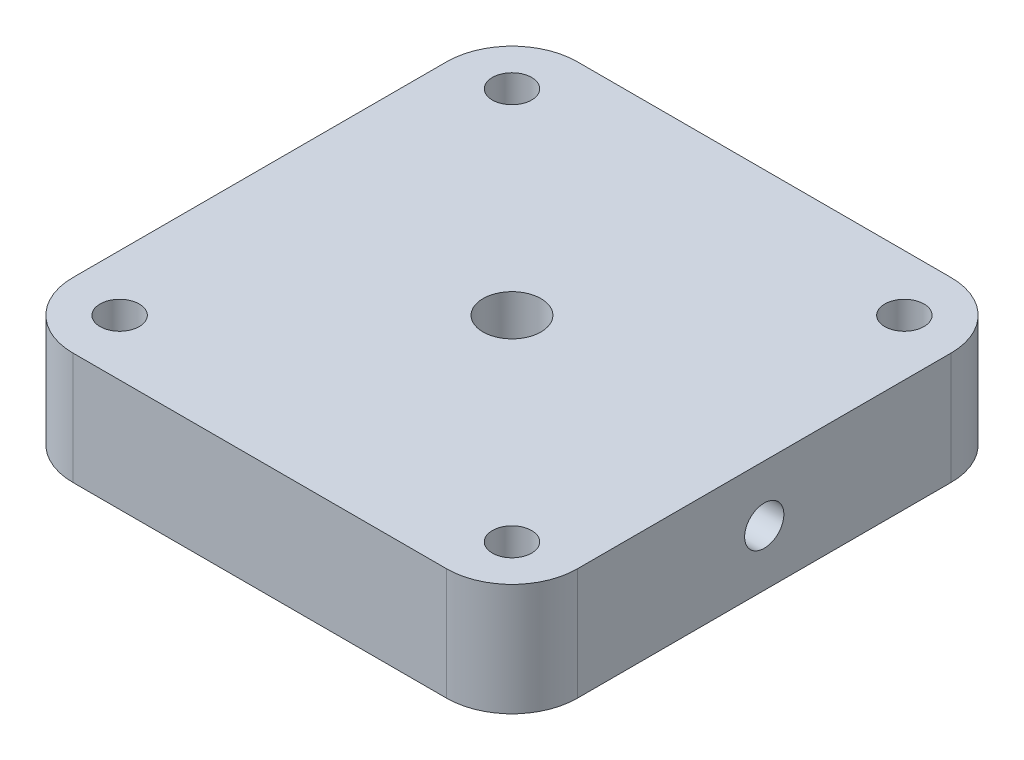
ISO-10303-21;
HEADER;
FILE_DESCRIPTION(('STEP AP214'),'2;1');
FILE_NAME('part.step','',(''),(''),'','','');
FILE_SCHEMA(('AUTOMOTIVE_DESIGN { 1 0 10303 214 1 1 1 1 }'));
ENDSEC;
DATA;
#1=APPLICATION_CONTEXT('core data for automotive mechanical design processes');
#2=APPLICATION_PROTOCOL_DEFINITION('international standard','automotive_design',2000,#1);
#3=PRODUCT_CONTEXT('',#1,'mechanical');
#4=PRODUCT('Part','Part','',(#3));
#5=PRODUCT_RELATED_PRODUCT_CATEGORY('part','',(#4));
#6=PRODUCT_DEFINITION_FORMATION('','',#4);
#7=PRODUCT_DEFINITION_CONTEXT('part definition',#1,'design');
#8=PRODUCT_DEFINITION('design','',#6,#7);
#9=PRODUCT_DEFINITION_SHAPE('','',#8);
#10=(LENGTH_UNIT() NAMED_UNIT(*) SI_UNIT(.MILLI.,.METRE.));
#11=(NAMED_UNIT(*) PLANE_ANGLE_UNIT() SI_UNIT($,.RADIAN.));
#12=(NAMED_UNIT(*) SI_UNIT($,.STERADIAN.) SOLID_ANGLE_UNIT());
#13=UNCERTAINTY_MEASURE_WITH_UNIT(LENGTH_MEASURE(1.E-05),#10,'distance_accuracy_value','');
#14=(GEOMETRIC_REPRESENTATION_CONTEXT(3) GLOBAL_UNCERTAINTY_ASSIGNED_CONTEXT((#13)) GLOBAL_UNIT_ASSIGNED_CONTEXT((#10,
#11,#12)) REPRESENTATION_CONTEXT('',''));
#15=CARTESIAN_POINT('',(0.,0.,0.));
#16=DIRECTION('',(0.,0.,1.));
#17=DIRECTION('',(1.,0.,0.));
#18=AXIS2_PLACEMENT_3D('',#15,#16,#17);
#19=CARTESIAN_POINT('',(0.,6.,0.));
#20=DIRECTION('',(0.,-1.,0.));
#21=DIRECTION('',(0.,0.,-1.));
#22=AXIS2_PLACEMENT_3D('',#19,#20,#21);
#23=CYLINDRICAL_SURFACE('',#22,1.55);
#24=CARTESIAN_POINT('',(0.,6.,0.));
#25=DIRECTION('',(0.,1.,0.));
#26=DIRECTION('',(0.,0.,1.));
#27=AXIS2_PLACEMENT_3D('',#24,#25,#26);
#28=CIRCLE('',#27,1.55);
#29=CARTESIAN_POINT('',(0.,6.,1.55));
#30=VERTEX_POINT('',#29);
#31=EDGE_CURVE('E150',#30,#30,#28,.T.);
#32=ORIENTED_EDGE('',*,*,#31,.T.);
#33=EDGE_LOOP('',(#32));
#34=FACE_BOUND('',#33,.T.);
#35=CARTESIAN_POINT('',(1.14017542509914,3.,-1.05));
#36=CARTESIAN_POINT('',(1.14017867015507,2.94900963420674,-1.04999821419493));
#37=CARTESIAN_POINT('',(1.14366002654204,2.89800924220033,-1.04625354384456));
#38=CARTESIAN_POINT('',(1.1568831260506,2.79785450026968,-1.03160621451335));
#39=CARTESIAN_POINT('',(1.16663643736445,2.74870373954835,-1.02069032790875));
#40=CARTESIAN_POINT('',(1.19063587654834,2.65402513586156,-0.99258247022336));
#41=CARTESIAN_POINT('',(1.20483629623293,2.60846608887573,-0.97545408099523));
#42=CARTESIAN_POINT('',(1.23604765734176,2.52095107432004,-0.935588965368678));
#43=CARTESIAN_POINT('',(1.2530590702133,2.47899571294126,-0.912851297891147));
#44=CARTESIAN_POINT('',(1.29126839399223,2.39244917131674,-0.858143379971789));
#45=CARTESIAN_POINT('',(1.31269852239262,2.34852831311729,-0.82527482070063));
#46=CARTESIAN_POINT('',(1.35542510236173,2.2662339234301,-0.753052250023912));
#47=CARTESIAN_POINT('',(1.37672137615719,2.22786669647558,-0.713690974768842));
#48=CARTESIAN_POINT('',(1.42057281100614,2.15198704860325,-0.622421145712551));
#49=CARTESIAN_POINT('',(1.44282976523745,2.11548505936816,-0.569515093428983));
#50=CARTESIAN_POINT('',(1.48244379819408,2.05224164661509,-0.456532980371657));
#51=CARTESIAN_POINT('',(1.49980994826338,2.02548212564266,-0.396470491729013));
#52=CARTESIAN_POINT('',(1.52395637739943,1.98877337115996,-0.286977102679294));
#53=CARTESIAN_POINT('',(1.53230674875396,1.97627768189748,-0.238739890848447));
#54=CARTESIAN_POINT('',(1.54441732768806,1.958236651145,-0.140428894987793));
#55=CARTESIAN_POINT('',(1.54818104655478,1.9526859928368,-0.0903565461264037));
#56=CARTESIAN_POINT('',(1.55078454545249,1.94884129107043,0.0102799053623988));
#57=CARTESIAN_POINT('',(1.54961608027011,1.9505593989394,0.0608446903432232));
#58=CARTESIAN_POINT('',(1.5424453765433,1.96117719516602,0.160866717743167));
#59=CARTESIAN_POINT('',(1.53644171779535,1.97007899353435,0.210323630368249));
#60=CARTESIAN_POINT('',(1.52027351978192,1.99436012750092,0.305905604269505));
#61=CARTESIAN_POINT('',(1.51018596000131,2.00961976821787,0.352074663851375));
#62=CARTESIAN_POINT('',(1.48661872554945,2.04594244074747,0.441122460304474));
#63=CARTESIAN_POINT('',(1.47313840723046,2.06700657381527,0.48400057082599));
#64=CARTESIAN_POINT('',(1.44200714008745,2.11693224909356,0.570490025978871));
#65=CARTESIAN_POINT('',(1.42405735210557,2.14640508912612,0.613639189387359));
#66=CARTESIAN_POINT('',(1.3863364122706,2.21094062254783,0.694675336425618));
#67=CARTESIAN_POINT('',(1.36656315993046,2.24600979729875,0.732556122132322));
#68=CARTESIAN_POINT('',(1.32320458148413,2.32749756325242,0.808610513798524));
#69=CARTESIAN_POINT('',(1.29953795721076,2.37483289879481,0.845759562267655));
#70=CARTESIAN_POINT('',(1.25409644644155,2.47579828748114,0.911781713046712));
#71=CARTESIAN_POINT('',(1.23232049517091,2.529424757092,0.940659494850997));
#72=CARTESIAN_POINT('',(1.19833674612205,2.62899504546996,0.983387524367705));
#73=CARTESIAN_POINT('',(1.1850845633505,2.67374436865162,0.999177497539191));
#74=CARTESIAN_POINT('',(1.16308870281454,2.76597202100341,1.0247005377039));
#75=CARTESIAN_POINT('',(1.15433680120382,2.81344519477477,1.03444465971397));
#76=CARTESIAN_POINT('',(1.14267160065129,2.91042516719409,1.04732201747659));
#77=CARTESIAN_POINT('',(1.13980605917333,2.959945300333,1.05040118959419));
#78=CARTESIAN_POINT('',(1.14062241382638,3.05887013095543,1.04951451812422));
#79=CARTESIAN_POINT('',(1.14430452385913,3.10827482461493,1.04554844437926));
#80=CARTESIAN_POINT('',(1.15676027366424,3.19982312256097,1.03173431058622));
#81=CARTESIAN_POINT('',(1.16492289209837,3.24216368215364,1.02258858266146));
#82=CARTESIAN_POINT('',(1.18481280391291,3.32463243729466,0.999475254976788));
#83=CARTESIAN_POINT('',(1.19654335846435,3.36475856899953,0.985503242296032));
#84=CARTESIAN_POINT('',(1.22827804506535,3.45988463054165,0.945901634432641));
#85=CARTESIAN_POINT('',(1.2496276112737,3.51343147689458,0.917856367454053));
#86=CARTESIAN_POINT('',(1.29439957988697,3.6144312656647,0.853562742804815));
#87=CARTESIAN_POINT('',(1.31782576050675,3.66187269890165,0.817299238222145));
#88=CARTESIAN_POINT('',(1.36458676622985,3.75069131865502,0.736619512937508));
#89=CARTESIAN_POINT('',(1.38791595923925,3.79197668487577,0.692098565958788));
#90=CARTESIAN_POINT('',(1.43188834177728,3.86672651376633,0.595808158198262));
#91=CARTESIAN_POINT('',(1.45253576557754,3.90020337355864,0.544050398791507));
#92=CARTESIAN_POINT('',(1.48584758053399,3.95293277528256,0.443880565912961));
#93=CARTESIAN_POINT('',(1.4992781455831,3.97365436686804,0.396498721397153));
#94=CARTESIAN_POINT('',(1.52186138768814,4.0080832741919,0.298278889511241));
#95=CARTESIAN_POINT('',(1.53101680898026,4.02179509007789,0.247443143293868));
#96=CARTESIAN_POINT('',(1.54424865884391,4.0415172234934,0.143379502371016));
#97=CARTESIAN_POINT('',(1.54830086878771,4.04749082108213,0.0901414337876248));
#98=CARTESIAN_POINT('',(1.55083034670219,4.05122647541262,-0.0167540354150383));
#99=CARTESIAN_POINT('',(1.54930871354019,4.04899015071701,-0.0704113512996604));
#100=CARTESIAN_POINT('',(1.54119463080679,4.03696557613547,-0.172088179712366));
#101=CARTESIAN_POINT('',(1.53501557154223,4.02779279592043,-0.220216418794356));
#102=CARTESIAN_POINT('',(1.51859400866711,4.00310145741962,-0.314076134260564));
#103=CARTESIAN_POINT('',(1.50835085830735,3.98758188910993,-0.359807227857124));
#104=CARTESIAN_POINT('',(1.48393914823175,3.94989069947766,-0.450258358624311));
#105=CARTESIAN_POINT('',(1.46959480663393,3.92741626691739,-0.494803455011253));
#106=CARTESIAN_POINT('',(1.43826428265189,3.87692418956758,-0.579605927185485));
#107=CARTESIAN_POINT('',(1.42127667766249,3.84890355758936,-0.619860974294072));
#108=CARTESIAN_POINT('',(1.3829237609655,3.78313699544349,-0.701692388600341));
#109=CARTESIAN_POINT('',(1.36129105992349,3.74455379270573,-0.74247018998955));
#110=CARTESIAN_POINT('',(1.31769231231216,3.66148742431758,-0.817352909695226));
#111=CARTESIAN_POINT('',(1.29572599449733,3.61699920204656,-0.851452046239778));
#112=CARTESIAN_POINT('',(1.25459217589983,3.52498471912444,-0.910898905905993));
#113=CARTESIAN_POINT('',(1.23533908553332,3.47772889961438,-0.936604111165215));
#114=CARTESIAN_POINT('',(1.20053484703963,3.37870665273446,-0.98082077047066));
#115=CARTESIAN_POINT('',(1.18497755506889,3.32694790950188,-0.999344196278547));
#116=CARTESIAN_POINT('',(1.16227015819414,3.22952719825286,-1.02560981703896));
#117=CARTESIAN_POINT('',(1.15410464817601,3.18447294420416,-1.03470153399788));
#118=CARTESIAN_POINT('',(1.14305924749589,3.09294728495041,-1.04689353441485));
#119=CARTESIAN_POINT('',(1.14017246722499,3.0464778075418,-1.05000162776444));
#120=CARTESIAN_POINT('',(1.14017542509914,3.,-1.05));
#121=B_SPLINE_CURVE_WITH_KNOTS('',3,(#35,#36,#37,#38,#39,#40,#41,#42,#43,#44,#45,#46,#47,#48,
#49,#50,#51,#52,#53,#54,#55,#56,#57,#58,#59,#60,#61,#62,#63,#64,#65,#66,#67,#68,#69,#70,#71,#72,
#73,#74,#75,#76,#77,#78,#79,#80,#81,#82,#83,#84,#85,#86,#87,#88,#89,#90,#91,#92,#93,#94,#95,#96,
#97,#98,#99,#100,#101,#102,#103,#104,#105,#106,#107,#108,#109,#110,#111,#112,#113,#114,#115,
#116,#117,#118,#119,#120),.UNSPECIFIED.,.T.,.F.,(4,2,2,2,2,2,2,2,2,2,2,2,2,2,2,2,2,2,2,2,2,2,2,
2,2,2,2,2,2,2,2,2,2,2,2,2,2,2,2,2,2,2,4),(0.,0.152757492701431,0.305797547440881,
0.457313578292913,0.608855046581285,0.78489427841393,0.961131810148025,1.16407376716305,
1.3666367954264,1.51755455491686,1.66835670740331,1.81941105808704,1.97050979296988,
2.11888397139867,2.26728631946701,2.43241709092866,2.5977405144187,2.79089941374287,
2.98394881599575,3.13121136561914,3.27820384158419,3.42638426684011,3.57456953301222,
3.70629384021264,3.83813890995304,4.02944283538514,4.2211022598794,4.41538314525939,
4.60935344988734,4.76897940160997,4.92850274729966,5.08878033450001,5.24902632513084,
5.3965133566357,5.54402386827438,5.69917184581499,5.85440361472219,6.03419476174309,
6.21414087398844,6.38491478711176,6.55540278974062,6.69482360862136,6.8340623302091),.UNSPECIFIED.);
#122=CARTESIAN_POINT('',(1.14017542509914,3.,1.05));
#123=VERTEX_POINT('',#122);
#124=CARTESIAN_POINT('',(1.14017542509914,3.,-1.05));
#125=VERTEX_POINT('',#124);
#126=EDGE_CURVE('E178',#123,#125,#121,.T.);
#127=ORIENTED_EDGE('',*,*,#126,.F.);
#128=CARTESIAN_POINT('',(0.,3.,0.));
#129=DIRECTION('',(0.,-1.,0.));
#130=DIRECTION('',(0.,0.,-1.));
#131=AXIS2_PLACEMENT_3D('',#128,#129,#130);
#132=CIRCLE('',#131,1.55);
#133=CARTESIAN_POINT('',(-1.14017542509914,3.,1.05));
#134=VERTEX_POINT('',#133);
#135=EDGE_CURVE('E222',#123,#134,#132,.T.);
#136=ORIENTED_EDGE('',*,*,#135,.T.);
#137=CARTESIAN_POINT('',(-1.14017542509914,3.,-1.05));
#138=CARTESIAN_POINT('',(-1.14017867015507,3.05099036579326,-1.04999821419493));
#139=CARTESIAN_POINT('',(-1.14366002654204,3.10199075779967,-1.04625354384456));
#140=CARTESIAN_POINT('',(-1.1568831260506,3.20214549973032,-1.03160621451335));
#141=CARTESIAN_POINT('',(-1.16663643736445,3.25129626045165,-1.02069032790875));
#142=CARTESIAN_POINT('',(-1.19063587654834,3.34597486413844,-0.992582470223359));
#143=CARTESIAN_POINT('',(-1.20483629623293,3.39153391112427,-0.975454080995229));
#144=CARTESIAN_POINT('',(-1.23604765734176,3.47904892567996,-0.935588965368677));
#145=CARTESIAN_POINT('',(-1.2530590702133,3.52100428705874,-0.912851297891146));
#146=CARTESIAN_POINT('',(-1.29126839399223,3.60755082868326,-0.858143379971789));
#147=CARTESIAN_POINT('',(-1.31269852239262,3.65147168688271,-0.825274820700629));
#148=CARTESIAN_POINT('',(-1.35542510236173,3.7337660765699,-0.753052250023912));
#149=CARTESIAN_POINT('',(-1.37672137615718,3.77213330352442,-0.713690974768842));
#150=CARTESIAN_POINT('',(-1.42057281100613,3.84801295139675,-0.622421145712551));
#151=CARTESIAN_POINT('',(-1.44282976523745,3.88451494063184,-0.569515093428983));
#152=CARTESIAN_POINT('',(-1.48244379819407,3.94775835338491,-0.456532980371657));
#153=CARTESIAN_POINT('',(-1.49980994826337,3.97451787435734,-0.396470491729013));
#154=CARTESIAN_POINT('',(-1.52395637739942,4.01122662884004,-0.286977102679294));
#155=CARTESIAN_POINT('',(-1.53230674875396,4.02372231810252,-0.238739890848447));
#156=CARTESIAN_POINT('',(-1.54441732768806,4.041763348855,-0.140428894987793));
#157=CARTESIAN_POINT('',(-1.54818104655478,4.0473140071632,-0.0903565461264036));
#158=CARTESIAN_POINT('',(-1.55078454545249,4.05115870892957,0.0102799053623991));
#159=CARTESIAN_POINT('',(-1.54961608027011,4.0494406010606,0.0608446903432236));
#160=CARTESIAN_POINT('',(-1.5424453765433,4.03882280483398,0.160866717743167));
#161=CARTESIAN_POINT('',(-1.53644171779534,4.02992100646565,0.21032363036825));
#162=CARTESIAN_POINT('',(-1.52027351978191,4.00563987249908,0.305905604269505));
#163=CARTESIAN_POINT('',(-1.51018596000131,3.99038023178214,0.352074663851375));
#164=CARTESIAN_POINT('',(-1.48661872554945,3.95405755925253,0.441122460304475));
#165=CARTESIAN_POINT('',(-1.47313840723045,3.93299342618473,0.48400057082599));
#166=CARTESIAN_POINT('',(-1.44200714008745,3.88306775090644,0.570490025978872));
#167=CARTESIAN_POINT('',(-1.42405735210556,3.85359491087388,0.61363918938736));
#168=CARTESIAN_POINT('',(-1.3863364122706,3.78905937745217,0.694675336425618));
#169=CARTESIAN_POINT('',(-1.36656315993045,3.75399020270125,0.732556122132323));
#170=CARTESIAN_POINT('',(-1.32320458148412,3.67250243674758,0.808610513798525));
#171=CARTESIAN_POINT('',(-1.29953795721076,3.62516710120519,0.845759562267655));
#172=CARTESIAN_POINT('',(-1.25409644644155,3.52420171251886,0.911781713046712));
#173=CARTESIAN_POINT('',(-1.2323204951709,3.470575242908,0.940659494850998));
#174=CARTESIAN_POINT('',(-1.19833674612205,3.37100495453004,0.983387524367705));
#175=CARTESIAN_POINT('',(-1.18508456335049,3.32625563134838,0.999177497539191));
#176=CARTESIAN_POINT('',(-1.16308870281454,3.23402797899659,1.0247005377039));
#177=CARTESIAN_POINT('',(-1.15433680120381,3.18655480522523,1.03444465971397));
#178=CARTESIAN_POINT('',(-1.14267160065129,3.0895748328059,1.04732201747659));
#179=CARTESIAN_POINT('',(-1.13980605917333,3.040054699667,1.05040118959419));
#180=CARTESIAN_POINT('',(-1.14062241382638,2.94112986904457,1.04951451812422));
#181=CARTESIAN_POINT('',(-1.14430452385912,2.89172517538507,1.04554844437926));
#182=CARTESIAN_POINT('',(-1.15676027366423,2.80017687743903,1.03173431058622));
#183=CARTESIAN_POINT('',(-1.16492289209836,2.75783631784636,1.02258858266146));
#184=CARTESIAN_POINT('',(-1.18481280391291,2.67536756270534,0.999475254976788));
#185=CARTESIAN_POINT('',(-1.19654335846434,2.63524143100046,0.985503242296032));
#186=CARTESIAN_POINT('',(-1.22827804506535,2.54011536945834,0.945901634432641));
#187=CARTESIAN_POINT('',(-1.24962761127369,2.48656852310542,0.917856367454054));
#188=CARTESIAN_POINT('',(-1.29439957988697,2.3855687343353,0.853562742804815));
#189=CARTESIAN_POINT('',(-1.31782576050674,2.33812730109835,0.817299238222145));
#190=CARTESIAN_POINT('',(-1.36458676622985,2.24930868134498,0.736619512937507));
#191=CARTESIAN_POINT('',(-1.38791595923925,2.20802331512423,0.692098565958788));
#192=CARTESIAN_POINT('',(-1.43188834177727,2.13327348623367,0.595808158198261));
#193=CARTESIAN_POINT('',(-1.45253576557754,2.09979662644136,0.544050398791507));
#194=CARTESIAN_POINT('',(-1.48584758053398,2.04706722471744,0.44388056591296));
#195=CARTESIAN_POINT('',(-1.49927814558309,2.02634563313196,0.396498721397153));
#196=CARTESIAN_POINT('',(-1.52186138768814,1.9919167258081,0.29827888951124));
#197=CARTESIAN_POINT('',(-1.53101680898026,1.97820490992211,0.247443143293868));
#198=CARTESIAN_POINT('',(-1.54424865884391,1.9584827765066,0.143379502371016));
#199=CARTESIAN_POINT('',(-1.5483008687877,1.95250917891787,0.0901414337876245));
#200=CARTESIAN_POINT('',(-1.55083034670219,1.94877352458738,-0.0167540354150383));
#201=CARTESIAN_POINT('',(-1.54930871354019,1.95100984928299,-0.0704113512996602));
#202=CARTESIAN_POINT('',(-1.54119463080679,1.96303442386453,-0.172088179712366));
#203=CARTESIAN_POINT('',(-1.53501557154223,1.97220720407957,-0.220216418794355));
#204=CARTESIAN_POINT('',(-1.5185940086671,1.99689854258038,-0.314076134260563));
#205=CARTESIAN_POINT('',(-1.50835085830735,2.01241811089007,-0.359807227857123));
#206=CARTESIAN_POINT('',(-1.48393914823174,2.05010930052234,-0.450258358624311));
#207=CARTESIAN_POINT('',(-1.46959480663393,2.07258373308261,-0.494803455011252));
#208=CARTESIAN_POINT('',(-1.43826428265189,2.12307581043242,-0.579605927185485));
#209=CARTESIAN_POINT('',(-1.42127667766248,2.15109644241064,-0.619860974294072));
#210=CARTESIAN_POINT('',(-1.3829237609655,2.21686300455651,-0.701692388600341));
#211=CARTESIAN_POINT('',(-1.36129105992348,2.25544620729427,-0.74247018998955));
#212=CARTESIAN_POINT('',(-1.31769231231216,2.33851257568242,-0.817352909695226));
#213=CARTESIAN_POINT('',(-1.29572599449733,2.38300079795344,-0.851452046239777));
#214=CARTESIAN_POINT('',(-1.25459217589982,2.47501528087556,-0.910898905905993));
#215=CARTESIAN_POINT('',(-1.23533908553331,2.52227110038562,-0.936604111165215));
#216=CARTESIAN_POINT('',(-1.20053484703963,2.62129334726554,-0.98082077047066));
#217=CARTESIAN_POINT('',(-1.18497755506889,2.67305209049812,-0.999344196278547));
#218=CARTESIAN_POINT('',(-1.16227015819414,2.77047280174714,-1.02560981703896));
#219=CARTESIAN_POINT('',(-1.15410464817601,2.81552705579584,-1.03470153399788));
#220=CARTESIAN_POINT('',(-1.14305924749589,2.90705271504959,-1.04689353441485));
#221=CARTESIAN_POINT('',(-1.14017246722498,2.9535221924582,-1.05000162776444));
#222=CARTESIAN_POINT('',(-1.14017542509914,3.,-1.05));
#223=B_SPLINE_CURVE_WITH_KNOTS('',3,(#137,#138,#139,#140,#141,#142,#143,#144,#145,#146,#147,
#148,#149,#150,#151,#152,#153,#154,#155,#156,#157,#158,#159,#160,#161,#162,#163,#164,#165,#166,
#167,#168,#169,#170,#171,#172,#173,#174,#175,#176,#177,#178,#179,#180,#181,#182,#183,#184,#185,
#186,#187,#188,#189,#190,#191,#192,#193,#194,#195,#196,#197,#198,#199,#200,#201,#202,#203,#204,
#205,#206,#207,#208,#209,#210,#211,#212,#213,#214,#215,#216,#217,#218,#219,#220,#221,#222),
.UNSPECIFIED.,.T.,.F.,(4,2,2,2,2,2,2,2,2,2,2,2,2,2,2,2,2,2,2,2,2,2,2,2,2,2,2,2,2,2,2,2,2,2,2,2,
2,2,2,2,2,2,4),(0.,0.152757492701431,0.305797547440881,0.457313578292913,0.608855046581284,
0.784894278413931,0.961131810148025,1.16407376716304,1.3666367954264,1.51755455491686,
1.66835670740331,1.81941105808704,1.97050979296988,2.11888397139867,2.26728631946701,
2.43241709092866,2.5977405144187,2.79089941374287,2.98394881599575,3.13121136561914,
3.27820384158419,3.42638426684011,3.57456953301222,3.70629384021264,3.83813890995304,
4.02944283538514,4.2211022598794,4.41538314525939,4.60935344988734,4.76897940160997,
4.92850274729967,5.08878033450001,5.24902632513084,5.3965133566357,5.54402386827439,
5.69917184581499,5.85440361472219,6.03419476174309,6.21414087398845,6.38491478711177,
6.55540278974062,6.69482360862136,6.8340623302091),.UNSPECIFIED.);
#224=CARTESIAN_POINT('',(-1.14017542509914,3.,-1.05));
#225=VERTEX_POINT('',#224);
#226=EDGE_CURVE('E186',#225,#134,#223,.T.);
#227=ORIENTED_EDGE('',*,*,#226,.F.);
#228=EDGE_CURVE('E235',#225,#125,#132,.T.);
#229=ORIENTED_EDGE('',*,*,#228,.T.);
#230=EDGE_LOOP('',(#127,#136,#227,#229));
#231=FACE_BOUND('',#230,.T.);
#232=ADVANCED_FACE('F36',(#34,#231),#23,.F.);
#233=CARTESIAN_POINT('',(-13.5,3.,0.));
#234=DIRECTION('',(1.,0.,0.));
#235=DIRECTION('',(0.,0.,-1.));
#236=AXIS2_PLACEMENT_3D('',#233,#234,#235);
#237=CYLINDRICAL_SURFACE('',#236,1.05);
#238=CARTESIAN_POINT('',(13.5,3.,0.));
#239=DIRECTION('',(1.,0.,0.));
#240=DIRECTION('',(0.,0.,-1.));
#241=AXIS2_PLACEMENT_3D('',#238,#239,#240);
#242=CIRCLE('',#241,1.05);
#243=CARTESIAN_POINT('',(13.5,3.,-1.05));
#244=VERTEX_POINT('',#243);
#245=EDGE_CURVE('E451',#244,#244,#242,.T.);
#246=ORIENTED_EDGE('',*,*,#245,.T.);
#247=EDGE_LOOP('',(#246));
#248=FACE_BOUND('',#247,.T.);
#249=DIRECTION('',(1.,0.,0.));
#250=VECTOR('',#249,1.);
#251=CARTESIAN_POINT('',(-13.5,3.,-1.05));
#252=LINE('',#251,#250);
#253=CARTESIAN_POINT('',(3.85972796968906,3.,-1.05));
#254=VERTEX_POINT('',#253);
#255=EDGE_CURVE('E433',#254,#125,#252,.F.);
#256=ORIENTED_EDGE('',*,*,#255,.F.);
#257=CARTESIAN_POINT('',(3.85972796968906,3.,-1.05));
#258=CARTESIAN_POINT('',(3.85972589509691,2.97100508393124,-1.05000041093511));
#259=CARTESIAN_POINT('',(3.86005510682981,2.94202458878458,-1.04879822618671));
#260=CARTESIAN_POINT('',(3.86135471428386,2.88428136080562,-1.04400620248429));
#261=CARTESIAN_POINT('',(3.86232499380119,2.85551858946293,-1.04041679625169));
#262=CARTESIAN_POINT('',(3.86615789652127,2.76999505024332,-1.02612191748033));
#263=CARTESIAN_POINT('',(3.86994283738925,2.71382361710187,-1.01188953807667));
#264=CARTESIAN_POINT('',(3.87952860603409,2.60477514344093,-0.974487150564541));
#265=CARTESIAN_POINT('',(3.88532912541712,2.55189760039814,-0.951318509690217));
#266=CARTESIAN_POINT('',(3.89828897620204,2.45075052935718,-0.896731610452436));
#267=CARTESIAN_POINT('',(3.90544873469527,2.40248245690135,-0.865310757939292));
#268=CARTESIAN_POINT('',(3.92051271416029,2.31078768664283,-0.794306021862427));
#269=CARTESIAN_POINT('',(3.92842973333716,2.26748901294265,-0.754559563744397));
#270=CARTESIAN_POINT('',(3.94400624712846,2.18808608855812,-0.668378148532557));
#271=CARTESIAN_POINT('',(3.95166569994227,2.15198300101098,-0.621942112182287));
#272=CARTESIAN_POINT('',(3.96600698096459,2.08746566218246,-0.522811042669805));
#273=CARTESIAN_POINT('',(3.97267183824087,2.05917909900866,-0.470030240318601));
#274=CARTESIAN_POINT('',(3.9841250688853,2.01193080077701,-0.360260661703477));
#275=CARTESIAN_POINT('',(3.9889138379829,1.99296709900207,-0.303272775870727));
#276=CARTESIAN_POINT('',(3.99598473742512,1.96531663654345,-0.188048370230202));
#277=CARTESIAN_POINT('',(3.99832020118968,1.95641088408517,-0.129867732032565));
#278=CARTESIAN_POINT('',(4.00040768923004,1.94844046614079,-0.0127931794723756));
#279=CARTESIAN_POINT('',(4.00016007657908,1.9493744176013,0.0461006334851069));
#280=CARTESIAN_POINT('',(3.99714844589584,1.96090222554085,0.161404284190518));
#281=CARTESIAN_POINT('',(3.99444610434825,1.97125933000468,0.217839647895725));
#282=CARTESIAN_POINT('',(3.98690122809151,2.00095733822621,0.328140900717784));
#283=CARTESIAN_POINT('',(3.98205859352889,2.02029866113681,0.382006669822558));
#284=CARTESIAN_POINT('',(3.97068497604656,2.06760032395814,0.486250220379981));
#285=CARTESIAN_POINT('',(3.9641380257106,2.09564268677202,0.536588969055384));
#286=CARTESIAN_POINT('',(3.95006261095049,2.15948719902156,0.631926450165223));
#287=CARTESIAN_POINT('',(3.94253398096584,2.19529065804424,0.676924279401458));
#288=CARTESIAN_POINT('',(3.92704843128739,2.27489612588144,0.761712019192579));
#289=CARTESIAN_POINT('',(3.91908543177086,2.31890393768887,0.801307793279266));
#290=CARTESIAN_POINT('',(3.90382904931957,2.41303022213384,0.872612463102125));
#291=CARTESIAN_POINT('',(3.89653585135374,2.46315037388147,0.904319184345149));
#292=CARTESIAN_POINT('',(3.88341950614637,2.56849769971717,0.9590902464757));
#293=CARTESIAN_POINT('',(3.87760597527017,2.62375524655769,0.982098502319286));
#294=CARTESIAN_POINT('',(3.86823023573185,2.73751268363763,1.01840677723459));
#295=CARTESIAN_POINT('',(3.86466465082791,2.79600756720564,1.03172136013559));
#296=CARTESIAN_POINT('',(3.86154307198327,2.87918254923848,1.04330890511511));
#297=CARTESIAN_POINT('',(3.86086355770803,2.9032923090879,1.04581834838797));
#298=CARTESIAN_POINT('',(3.85995615152732,2.95159750033955,1.04916209025311));
#299=CARTESIAN_POINT('',(3.85972754076294,2.97579273366939,1.04999905524417));
#300=CARTESIAN_POINT('',(3.85972796968906,3.,1.05));
#301=B_SPLINE_CURVE_WITH_KNOTS('',3,(#257,#258,#259,#260,#261,#262,#263,#264,#265,#266,#267,
#268,#269,#270,#271,#272,#273,#274,#275,#276,#277,#278,#279,#280,#281,#282,#283,#284,#285,#286,
#287,#288,#289,#290,#291,#292,#293,#294,#295,#296,#297,#298,#299,#300),.UNSPECIFIED.,.F.,.F.,(4,
2,2,2,2,2,2,2,2,2,2,2,2,2,2,2,2,2,2,2,2,4),(0.,0.0869296288490659,0.173843504629229,
0.347151827150932,0.520433644279336,0.693769999289248,0.870873682432977,1.04800597048916,
1.22788053839718,1.40771714431735,1.58355776061575,1.75937366136167,1.93089069995578,
2.10241574137011,2.27560953346289,2.44883257260205,2.62719526093538,2.80560705780703,
2.9851503382079,3.16442331195838,3.23712167826147,3.30970405024241),.UNSPECIFIED.);
#302=CARTESIAN_POINT('',(3.85972796968906,3.,1.05));
#303=VERTEX_POINT('',#302);
#304=EDGE_CURVE('E439',#254,#303,#301,.T.);
#305=ORIENTED_EDGE('',*,*,#304,.T.);
#306=DIRECTION('',(1.,0.,0.));
#307=VECTOR('',#306,1.);
#308=CARTESIAN_POINT('',(-13.5,3.,1.05));
#309=LINE('',#308,#307);
#310=EDGE_CURVE('E233',#123,#303,#309,.T.);
#311=ORIENTED_EDGE('',*,*,#310,.F.);
#312=ORIENTED_EDGE('',*,*,#126,.T.);
#313=EDGE_LOOP('',(#256,#305,#311,#312));
#314=FACE_BOUND('',#313,.T.);
#315=ADVANCED_FACE('F195',(#248,#314),#237,.F.);
#316=CARTESIAN_POINT('',(-13.5,3.,0.));
#317=DIRECTION('',(1.,0.,0.));
#318=DIRECTION('',(0.,0.,-1.));
#319=AXIS2_PLACEMENT_3D('',#316,#317,#318);
#320=CIRCLE('',#319,1.05);
#321=CARTESIAN_POINT('',(-13.5,3.,-1.05));
#322=VERTEX_POINT('',#321);
#323=EDGE_CURVE('E187',#322,#322,#320,.T.);
#324=ORIENTED_EDGE('',*,*,#323,.F.);
#325=EDGE_LOOP('',(#324));
#326=FACE_BOUND('',#325,.T.);
#327=DIRECTION('',(1.,0.,0.));
#328=VECTOR('',#327,1.);
#329=CARTESIAN_POINT('',(-13.5,3.,-1.05));
#330=LINE('',#329,#328);
#331=CARTESIAN_POINT('',(-3.85972796968906,3.,-1.05));
#332=VERTEX_POINT('',#331);
#333=EDGE_CURVE('E11',#225,#332,#330,.F.);
#334=ORIENTED_EDGE('',*,*,#333,.F.);
#335=ORIENTED_EDGE('',*,*,#226,.T.);
#336=DIRECTION('',(1.,0.,0.));
#337=VECTOR('',#336,1.);
#338=CARTESIAN_POINT('',(-13.5,3.,1.05));
#339=LINE('',#338,#337);
#340=CARTESIAN_POINT('',(-3.85972796968906,3.,1.05));
#341=VERTEX_POINT('',#340);
#342=EDGE_CURVE('E177',#341,#134,#339,.T.);
#343=ORIENTED_EDGE('',*,*,#342,.F.);
#344=CARTESIAN_POINT('',(-3.85972796968906,3.,1.05));
#345=CARTESIAN_POINT('',(-3.85972589509691,2.97100508393124,1.05000041093511));
#346=CARTESIAN_POINT('',(-3.86005510682981,2.94202458878458,1.04879822618671));
#347=CARTESIAN_POINT('',(-3.86135471428386,2.88428136080562,1.04400620248429));
#348=CARTESIAN_POINT('',(-3.86232499380119,2.85551858946293,1.04041679625169));
#349=CARTESIAN_POINT('',(-3.86615789652127,2.76999505024332,1.02612191748033));
#350=CARTESIAN_POINT('',(-3.86994283738925,2.71382361710187,1.01188953807667));
#351=CARTESIAN_POINT('',(-3.87952860603409,2.60477514344093,0.97448715056454));
#352=CARTESIAN_POINT('',(-3.88532912541712,2.55189760039814,0.951318509690217));
#353=CARTESIAN_POINT('',(-3.89828897620204,2.45075052935718,0.896731610452436));
#354=CARTESIAN_POINT('',(-3.90544873469527,2.40248245690135,0.865310757939291));
#355=CARTESIAN_POINT('',(-3.92051271416029,2.31078768664283,0.794306021862427));
#356=CARTESIAN_POINT('',(-3.92842973333716,2.26748901294265,0.754559563744397));
#357=CARTESIAN_POINT('',(-3.94400624712846,2.18808608855812,0.668378148532557));
#358=CARTESIAN_POINT('',(-3.95166569994227,2.15198300101098,0.621942112182288));
#359=CARTESIAN_POINT('',(-3.96600698096459,2.08746566218246,0.522811042669805));
#360=CARTESIAN_POINT('',(-3.97267183824087,2.05917909900866,0.470030240318601));
#361=CARTESIAN_POINT('',(-3.9841250688853,2.01193080077701,0.360260661703478));
#362=CARTESIAN_POINT('',(-3.9889138379829,1.99296709900207,0.303272775870728));
#363=CARTESIAN_POINT('',(-3.99598473742512,1.96531663654345,0.188048370230202));
#364=CARTESIAN_POINT('',(-3.99832020118968,1.95641088408517,0.129867732032566));
#365=CARTESIAN_POINT('',(-4.00040768923004,1.94844046614079,0.0127931794723757));
#366=CARTESIAN_POINT('',(-4.00016007657908,1.9493744176013,-0.0461006334851068));
#367=CARTESIAN_POINT('',(-3.99714844589584,1.96090222554085,-0.161404284190518));
#368=CARTESIAN_POINT('',(-3.99444610434825,1.97125933000468,-0.217839647895725));
#369=CARTESIAN_POINT('',(-3.98690122809151,2.00095733822621,-0.328140900717785));
#370=CARTESIAN_POINT('',(-3.98205859352889,2.02029866113681,-0.382006669822558));
#371=CARTESIAN_POINT('',(-3.97068497604656,2.06760032395814,-0.486250220379981));
#372=CARTESIAN_POINT('',(-3.9641380257106,2.09564268677202,-0.536588969055384));
#373=CARTESIAN_POINT('',(-3.95006261095049,2.15948719902156,-0.631926450165223));
#374=CARTESIAN_POINT('',(-3.94253398096584,2.19529065804424,-0.676924279401458));
#375=CARTESIAN_POINT('',(-3.92704843128739,2.27489612588144,-0.761712019192578));
#376=CARTESIAN_POINT('',(-3.91908543177086,2.31890393768887,-0.801307793279266));
#377=CARTESIAN_POINT('',(-3.90382904931957,2.41303022213384,-0.872612463102125));
#378=CARTESIAN_POINT('',(-3.89653585135374,2.46315037388147,-0.904319184345149));
#379=CARTESIAN_POINT('',(-3.88341950614637,2.56849769971717,-0.9590902464757));
#380=CARTESIAN_POINT('',(-3.87760597527017,2.62375524655769,-0.982098502319286));
#381=CARTESIAN_POINT('',(-3.86823023573185,2.73751268363763,-1.01840677723459));
#382=CARTESIAN_POINT('',(-3.86466465082791,2.79600756720564,-1.03172136013559));
#383=CARTESIAN_POINT('',(-3.86154307198327,2.87918254923848,-1.04330890511511));
#384=CARTESIAN_POINT('',(-3.86086355770803,2.9032923090879,-1.04581834838797));
#385=CARTESIAN_POINT('',(-3.85995615152732,2.95159750033955,-1.04916209025311));
#386=CARTESIAN_POINT('',(-3.85972754076294,2.97579273366939,-1.04999905524417));
#387=CARTESIAN_POINT('',(-3.85972796968906,3.,-1.05));
#388=B_SPLINE_CURVE_WITH_KNOTS('',3,(#344,#345,#346,#347,#348,#349,#350,#351,#352,#353,#354,
#355,#356,#357,#358,#359,#360,#361,#362,#363,#364,#365,#366,#367,#368,#369,#370,#371,#372,#373,
#374,#375,#376,#377,#378,#379,#380,#381,#382,#383,#384,#385,#386,#387),.UNSPECIFIED.,.F.,.F.,(4,
2,2,2,2,2,2,2,2,2,2,2,2,2,2,2,2,2,2,2,2,4),(0.,0.0869296288490659,0.173843504629229,
0.347151827150932,0.520433644279337,0.693769999289248,0.870873682432976,1.04800597048916,
1.22788053839718,1.40771714431735,1.58355776061575,1.75937366136167,1.93089069995578,
2.10241574137011,2.27560953346289,2.44883257260205,2.62719526093538,2.80560705780703,
2.9851503382079,3.16442331195838,3.23712167826147,3.30970405024241),.UNSPECIFIED.);
#389=EDGE_CURVE('E44',#341,#332,#388,.T.);
#390=ORIENTED_EDGE('',*,*,#389,.T.);
#391=EDGE_LOOP('',(#334,#335,#343,#390));
#392=FACE_BOUND('',#391,.T.);
#393=ADVANCED_FACE('F200',(#326,#392),#237,.F.);
#394=CARTESIAN_POINT('',(-10.,6.,10.));
#395=DIRECTION('',(0.,1.,0.));
#396=DIRECTION('',(0.,0.,1.));
#397=AXIS2_PLACEMENT_3D('',#394,#395,#396);
#398=PLANE('',#397);
#399=CARTESIAN_POINT('',(10.5,6.,10.5));
#400=DIRECTION('',(0.,1.,0.));
#401=DIRECTION('',(0.,0.,1.));
#402=AXIS2_PLACEMENT_3D('',#399,#400,#401);
#403=CIRCLE('',#402,1.04999999999999);
#404=CARTESIAN_POINT('',(10.5,6.,11.55));
#405=VERTEX_POINT('',#404);
#406=EDGE_CURVE('E248',#405,#405,#403,.T.);
#407=ORIENTED_EDGE('',*,*,#406,.F.);
#408=EDGE_LOOP('',(#407));
#409=FACE_BOUND('',#408,.T.);
#410=CARTESIAN_POINT('',(-10.5,6.,10.5));
#411=DIRECTION('',(0.,1.,0.));
#412=DIRECTION('',(0.,0.,1.));
#413=AXIS2_PLACEMENT_3D('',#410,#411,#412);
#414=CIRCLE('',#413,1.05);
#415=CARTESIAN_POINT('',(-10.5,6.,11.55));
#416=VERTEX_POINT('',#415);
#417=EDGE_CURVE('E260',#416,#416,#414,.T.);
#418=ORIENTED_EDGE('',*,*,#417,.F.);
#419=EDGE_LOOP('',(#418));
#420=FACE_BOUND('',#419,.T.);
#421=CARTESIAN_POINT('',(-10.,6.,10.));
#422=DIRECTION('',(0.,1.,0.));
#423=DIRECTION('',(0.,0.,1.));
#424=AXIS2_PLACEMENT_3D('',#421,#422,#423);
#425=CIRCLE('',#424,3.5);
#426=CARTESIAN_POINT('',(-13.5,6.,9.99999999999997));
#427=VERTEX_POINT('',#426);
#428=CARTESIAN_POINT('',(-9.99999999999997,6.,13.5));
#429=VERTEX_POINT('',#428);
#430=EDGE_CURVE('E162',#427,#429,#425,.T.);
#431=ORIENTED_EDGE('',*,*,#430,.T.);
#432=DIRECTION('',(1.,0.,0.));
#433=VECTOR('',#432,1.);
#434=CARTESIAN_POINT('',(-9.99999999999997,6.,13.5));
#435=LINE('',#434,#433);
#436=CARTESIAN_POINT('',(9.99999999999998,6.,13.5));
#437=VERTEX_POINT('',#436);
#438=EDGE_CURVE('E102',#429,#437,#435,.T.);
#439=ORIENTED_EDGE('',*,*,#438,.T.);
#440=CARTESIAN_POINT('',(10.,6.,10.));
#441=DIRECTION('',(0.,1.,0.));
#442=DIRECTION('',(0.,0.,1.));
#443=AXIS2_PLACEMENT_3D('',#440,#441,#442);
#444=CIRCLE('',#443,3.5);
#445=CARTESIAN_POINT('',(13.5,6.,9.99999999999997));
#446=VERTEX_POINT('',#445);
#447=EDGE_CURVE('E269',#437,#446,#444,.T.);
#448=ORIENTED_EDGE('',*,*,#447,.T.);
#449=DIRECTION('',(0.,0.,-1.));
#450=VECTOR('',#449,1.);
#451=CARTESIAN_POINT('',(13.5,6.,-9.99999999999997));
#452=LINE('',#451,#450);
#453=CARTESIAN_POINT('',(13.5,6.,-9.99999999999997));
#454=VERTEX_POINT('',#453);
#455=EDGE_CURVE('E271',#446,#454,#452,.T.);
#456=ORIENTED_EDGE('',*,*,#455,.T.);
#457=CARTESIAN_POINT('',(10.,6.,-10.));
#458=DIRECTION('',(0.,1.,0.));
#459=DIRECTION('',(0.,0.,1.));
#460=AXIS2_PLACEMENT_3D('',#457,#458,#459);
#461=CIRCLE('',#460,3.5);
#462=CARTESIAN_POINT('',(9.99999999999997,6.,-13.5));
#463=VERTEX_POINT('',#462);
#464=EDGE_CURVE('E125',#454,#463,#461,.T.);
#465=ORIENTED_EDGE('',*,*,#464,.T.);
#466=DIRECTION('',(-1.,0.,0.));
#467=VECTOR('',#466,1.);
#468=CARTESIAN_POINT('',(-9.99999999999998,6.,-13.5));
#469=LINE('',#468,#467);
#470=CARTESIAN_POINT('',(-9.99999999999998,6.,-13.5));
#471=VERTEX_POINT('',#470);
#472=EDGE_CURVE('E117',#463,#471,#469,.T.);
#473=ORIENTED_EDGE('',*,*,#472,.T.);
#474=CARTESIAN_POINT('',(-10.,6.,-10.));
#475=DIRECTION('',(0.,1.,0.));
#476=DIRECTION('',(0.,0.,1.));
#477=AXIS2_PLACEMENT_3D('',#474,#475,#476);
#478=CIRCLE('',#477,3.5);
#479=CARTESIAN_POINT('',(-13.5,6.,-9.99999999999997));
#480=VERTEX_POINT('',#479);
#481=EDGE_CURVE('E122',#471,#480,#478,.T.);
#482=ORIENTED_EDGE('',*,*,#481,.T.);
#483=DIRECTION('',(0.,0.,1.));
#484=VECTOR('',#483,1.);
#485=CARTESIAN_POINT('',(-13.5,6.,-9.99999999999997));
#486=LINE('',#485,#484);
#487=EDGE_CURVE('E60',#480,#427,#486,.T.);
#488=ORIENTED_EDGE('',*,*,#487,.T.);
#489=EDGE_LOOP('',(#431,#439,#448,#456,#465,#473,#482,#488));
#490=FACE_BOUND('',#489,.T.);
#491=ORIENTED_EDGE('',*,*,#31,.F.);
#492=EDGE_LOOP('',(#491));
#493=FACE_BOUND('',#492,.T.);
#494=CARTESIAN_POINT('',(-10.5,6.,-10.5));
#495=DIRECTION('',(0.,1.,0.));
#496=DIRECTION('',(0.,0.,1.));
#497=AXIS2_PLACEMENT_3D('',#494,#495,#496);
#498=CIRCLE('',#497,1.04999999999999);
#499=CARTESIAN_POINT('',(-10.5,6.,-9.45));
#500=VERTEX_POINT('',#499);
#501=EDGE_CURVE('E254',#500,#500,#498,.T.);
#502=ORIENTED_EDGE('',*,*,#501,.F.);
#503=EDGE_LOOP('',(#502));
#504=FACE_BOUND('',#503,.T.);
#505=CARTESIAN_POINT('',(10.5,6.,-10.5));
#506=DIRECTION('',(0.,1.,0.));
#507=DIRECTION('',(0.,0.,1.));
#508=AXIS2_PLACEMENT_3D('',#505,#506,#507);
#509=CIRCLE('',#508,1.05);
#510=CARTESIAN_POINT('',(10.5,6.,-9.45));
#511=VERTEX_POINT('',#510);
#512=EDGE_CURVE('E239',#511,#511,#509,.T.);
#513=ORIENTED_EDGE('',*,*,#512,.F.);
#514=EDGE_LOOP('',(#513));
#515=FACE_BOUND('',#514,.T.);
#516=ADVANCED_FACE('F119',(#409,#420,#490,#493,#504,#515),#398,.T.);
#517=CARTESIAN_POINT('',(-10.,0.,10.));
#518=DIRECTION('',(0.,1.,0.));
#519=DIRECTION('',(0.,0.,1.));
#520=AXIS2_PLACEMENT_3D('',#517,#518,#519);
#521=PLANE('',#520);
#522=CARTESIAN_POINT('',(0.,0.,0.));
#523=DIRECTION('',(0.,-1.,0.));
#524=DIRECTION('',(0.,0.,-1.));
#525=AXIS2_PLACEMENT_3D('',#522,#523,#524);
#526=CIRCLE('',#525,4.);
#527=CARTESIAN_POINT('',(0.,0.,-4.));
#528=VERTEX_POINT('',#527);
#529=EDGE_CURVE('E456',#528,#528,#526,.T.);
#530=ORIENTED_EDGE('',*,*,#529,.F.);
#531=EDGE_LOOP('',(#530));
#532=FACE_BOUND('',#531,.T.);
#533=CARTESIAN_POINT('',(-10.,0.,10.));
#534=DIRECTION('',(0.,1.,0.));
#535=DIRECTION('',(0.,0.,1.));
#536=AXIS2_PLACEMENT_3D('',#533,#534,#535);
#537=CIRCLE('',#536,3.5);
#538=CARTESIAN_POINT('',(-13.5,0.,9.99999999999997));
#539=VERTEX_POINT('',#538);
#540=CARTESIAN_POINT('',(-9.99999999999997,0.,13.5));
#541=VERTEX_POINT('',#540);
#542=EDGE_CURVE('E146',#539,#541,#537,.T.);
#543=ORIENTED_EDGE('',*,*,#542,.F.);
#544=DIRECTION('',(0.,0.,1.));
#545=VECTOR('',#544,1.);
#546=CARTESIAN_POINT('',(-13.5,0.,-9.99999999999997));
#547=LINE('',#546,#545);
#548=CARTESIAN_POINT('',(-13.5,0.,-9.99999999999997));
#549=VERTEX_POINT('',#548);
#550=EDGE_CURVE('E93',#549,#539,#547,.T.);
#551=ORIENTED_EDGE('',*,*,#550,.F.);
#552=CARTESIAN_POINT('',(-10.,0.,-10.));
#553=DIRECTION('',(0.,1.,0.));
#554=DIRECTION('',(0.,0.,1.));
#555=AXIS2_PLACEMENT_3D('',#552,#553,#554);
#556=CIRCLE('',#555,3.5);
#557=CARTESIAN_POINT('',(-9.99999999999998,0.,-13.5));
#558=VERTEX_POINT('',#557);
#559=EDGE_CURVE('E159',#558,#549,#556,.T.);
#560=ORIENTED_EDGE('',*,*,#559,.F.);
#561=DIRECTION('',(-1.,0.,0.));
#562=VECTOR('',#561,1.);
#563=CARTESIAN_POINT('',(-9.99999999999998,0.,-13.5));
#564=LINE('',#563,#562);
#565=CARTESIAN_POINT('',(9.99999999999997,0.,-13.5));
#566=VERTEX_POINT('',#565);
#567=EDGE_CURVE('E134',#566,#558,#564,.T.);
#568=ORIENTED_EDGE('',*,*,#567,.F.);
#569=CARTESIAN_POINT('',(10.,0.,-10.));
#570=DIRECTION('',(0.,1.,0.));
#571=DIRECTION('',(0.,0.,1.));
#572=AXIS2_PLACEMENT_3D('',#569,#570,#571);
#573=CIRCLE('',#572,3.5);
#574=CARTESIAN_POINT('',(13.5,0.,-9.99999999999997));
#575=VERTEX_POINT('',#574);
#576=EDGE_CURVE('E156',#575,#566,#573,.T.);
#577=ORIENTED_EDGE('',*,*,#576,.F.);
#578=DIRECTION('',(0.,0.,-1.));
#579=VECTOR('',#578,1.);
#580=CARTESIAN_POINT('',(13.5,0.,-9.99999999999997));
#581=LINE('',#580,#579);
#582=CARTESIAN_POINT('',(13.5,0.,9.99999999999997));
#583=VERTEX_POINT('',#582);
#584=EDGE_CURVE('E154',#583,#575,#581,.T.);
#585=ORIENTED_EDGE('',*,*,#584,.F.);
#586=CARTESIAN_POINT('',(10.,0.,10.));
#587=DIRECTION('',(0.,1.,0.));
#588=DIRECTION('',(0.,0.,1.));
#589=AXIS2_PLACEMENT_3D('',#586,#587,#588);
#590=CIRCLE('',#589,3.5);
#591=CARTESIAN_POINT('',(9.99999999999998,0.,13.5));
#592=VERTEX_POINT('',#591);
#593=EDGE_CURVE('E152',#592,#583,#590,.T.);
#594=ORIENTED_EDGE('',*,*,#593,.F.);
#595=DIRECTION('',(1.,0.,0.));
#596=VECTOR('',#595,1.);
#597=CARTESIAN_POINT('',(-9.99999999999997,0.,13.5));
#598=LINE('',#597,#596);
#599=EDGE_CURVE('E149',#541,#592,#598,.T.);
#600=ORIENTED_EDGE('',*,*,#599,.F.);
#601=EDGE_LOOP('',(#543,#551,#560,#568,#577,#585,#594,#600));
#602=FACE_BOUND('',#601,.T.);
#603=CARTESIAN_POINT('',(-10.5,0.,10.5));
#604=DIRECTION('',(0.,1.,0.));
#605=DIRECTION('',(0.,0.,1.));
#606=AXIS2_PLACEMENT_3D('',#603,#604,#605);
#607=CIRCLE('',#606,1.05);
#608=CARTESIAN_POINT('',(-10.5,0.,11.55));
#609=VERTEX_POINT('',#608);
#610=EDGE_CURVE('E257',#609,#609,#607,.T.);
#611=ORIENTED_EDGE('',*,*,#610,.T.);
#612=EDGE_LOOP('',(#611));
#613=FACE_BOUND('',#612,.T.);
#614=CARTESIAN_POINT('',(-10.5,0.,-10.5));
#615=DIRECTION('',(0.,1.,0.));
#616=DIRECTION('',(0.,0.,1.));
#617=AXIS2_PLACEMENT_3D('',#614,#615,#616);
#618=CIRCLE('',#617,1.04999999999999);
#619=CARTESIAN_POINT('',(-10.5,0.,-9.45));
#620=VERTEX_POINT('',#619);
#621=EDGE_CURVE('E251',#620,#620,#618,.T.);
#622=ORIENTED_EDGE('',*,*,#621,.T.);
#623=EDGE_LOOP('',(#622));
#624=FACE_BOUND('',#623,.T.);
#625=CARTESIAN_POINT('',(10.5,0.,10.5));
#626=DIRECTION('',(0.,1.,0.));
#627=DIRECTION('',(0.,0.,1.));
#628=AXIS2_PLACEMENT_3D('',#625,#626,#627);
#629=CIRCLE('',#628,1.04999999999999);
#630=CARTESIAN_POINT('',(10.5,0.,11.55));
#631=VERTEX_POINT('',#630);
#632=EDGE_CURVE('E244',#631,#631,#629,.T.);
#633=ORIENTED_EDGE('',*,*,#632,.T.);
#634=EDGE_LOOP('',(#633));
#635=FACE_BOUND('',#634,.T.);
#636=CARTESIAN_POINT('',(10.5,0.,-10.5));
#637=DIRECTION('',(0.,1.,0.));
#638=DIRECTION('',(0.,0.,1.));
#639=AXIS2_PLACEMENT_3D('',#636,#637,#638);
#640=CIRCLE('',#639,1.05);
#641=CARTESIAN_POINT('',(10.5,0.,-9.45));
#642=VERTEX_POINT('',#641);
#643=EDGE_CURVE('E237',#642,#642,#640,.T.);
#644=ORIENTED_EDGE('',*,*,#643,.T.);
#645=EDGE_LOOP('',(#644));
#646=FACE_BOUND('',#645,.T.);
#647=ADVANCED_FACE('F284',(#532,#602,#613,#624,#635,#646),#521,.F.);
#648=CARTESIAN_POINT('',(-10.,6.,10.));
#649=DIRECTION('',(0.,-1.,0.));
#650=DIRECTION('',(0.,0.,-1.));
#651=AXIS2_PLACEMENT_3D('',#648,#649,#650);
#652=CYLINDRICAL_SURFACE('',#651,3.5);
#653=ORIENTED_EDGE('',*,*,#542,.T.);
#654=DIRECTION('',(0.,-1.,0.));
#655=VECTOR('',#654,1.);
#656=CARTESIAN_POINT('',(-9.99999999999997,6.,13.5));
#657=LINE('',#656,#655);
#658=EDGE_CURVE('E175',#429,#541,#657,.T.);
#659=ORIENTED_EDGE('',*,*,#658,.F.);
#660=ORIENTED_EDGE('',*,*,#430,.F.);
#661=DIRECTION('',(0.,-1.,0.));
#662=VECTOR('',#661,1.);
#663=CARTESIAN_POINT('',(-13.5,6.,9.99999999999997));
#664=LINE('',#663,#662);
#665=EDGE_CURVE('E142',#427,#539,#664,.T.);
#666=ORIENTED_EDGE('',*,*,#665,.T.);
#667=EDGE_LOOP('',(#653,#659,#660,#666));
#668=FACE_BOUND('',#667,.T.);
#669=ADVANCED_FACE('F38',(#668),#652,.T.);
#670=CARTESIAN_POINT('',(-9.99999999999997,6.,13.5));
#671=DIRECTION('',(0.,0.,-1.));
#672=DIRECTION('',(-1.,0.,0.));
#673=AXIS2_PLACEMENT_3D('',#670,#671,#672);
#674=PLANE('',#673);
#675=ORIENTED_EDGE('',*,*,#599,.T.);
#676=DIRECTION('',(0.,-1.,0.));
#677=VECTOR('',#676,1.);
#678=CARTESIAN_POINT('',(9.99999999999998,6.,13.5));
#679=LINE('',#678,#677);
#680=EDGE_CURVE('E172',#437,#592,#679,.T.);
#681=ORIENTED_EDGE('',*,*,#680,.F.);
#682=ORIENTED_EDGE('',*,*,#438,.F.);
#683=ORIENTED_EDGE('',*,*,#658,.T.);
#684=EDGE_LOOP('',(#675,#681,#682,#683));
#685=FACE_BOUND('',#684,.T.);
#686=ADVANCED_FACE('F290',(#685),#674,.F.);
#687=CARTESIAN_POINT('',(10.,6.,10.));
#688=DIRECTION('',(0.,-1.,0.));
#689=DIRECTION('',(0.,0.,-1.));
#690=AXIS2_PLACEMENT_3D('',#687,#688,#689);
#691=CYLINDRICAL_SURFACE('',#690,3.5);
#692=ORIENTED_EDGE('',*,*,#593,.T.);
#693=DIRECTION('',(0.,-1.,0.));
#694=VECTOR('',#693,1.);
#695=CARTESIAN_POINT('',(13.5,6.,9.99999999999997));
#696=LINE('',#695,#694);
#697=EDGE_CURVE('E169',#446,#583,#696,.T.);
#698=ORIENTED_EDGE('',*,*,#697,.F.);
#699=ORIENTED_EDGE('',*,*,#447,.F.);
#700=ORIENTED_EDGE('',*,*,#680,.T.);
#701=EDGE_LOOP('',(#692,#698,#699,#700));
#702=FACE_BOUND('',#701,.T.);
#703=ADVANCED_FACE('F293',(#702),#691,.T.);
#704=CARTESIAN_POINT('',(13.5,6.,-9.99999999999997));
#705=DIRECTION('',(-1.,0.,0.));
#706=DIRECTION('',(0.,0.,1.));
#707=AXIS2_PLACEMENT_3D('',#704,#705,#706);
#708=PLANE('',#707);
#709=ORIENTED_EDGE('',*,*,#245,.F.);
#710=EDGE_LOOP('',(#709));
#711=FACE_BOUND('',#710,.T.);
#712=ORIENTED_EDGE('',*,*,#584,.T.);
#713=DIRECTION('',(0.,-1.,0.));
#714=VECTOR('',#713,1.);
#715=CARTESIAN_POINT('',(13.5,6.,-9.99999999999997));
#716=LINE('',#715,#714);
#717=EDGE_CURVE('E166',#454,#575,#716,.T.);
#718=ORIENTED_EDGE('',*,*,#717,.F.);
#719=ORIENTED_EDGE('',*,*,#455,.F.);
#720=ORIENTED_EDGE('',*,*,#697,.T.);
#721=EDGE_LOOP('',(#712,#718,#719,#720));
#722=FACE_BOUND('',#721,.T.);
#723=ADVANCED_FACE('F277',(#711,#722),#708,.F.);
#724=CARTESIAN_POINT('',(10.,6.,-10.));
#725=DIRECTION('',(0.,-1.,0.));
#726=DIRECTION('',(0.,0.,-1.));
#727=AXIS2_PLACEMENT_3D('',#724,#725,#726);
#728=CYLINDRICAL_SURFACE('',#727,3.5);
#729=ORIENTED_EDGE('',*,*,#576,.T.);
#730=DIRECTION('',(0.,-1.,0.));
#731=VECTOR('',#730,1.);
#732=CARTESIAN_POINT('',(9.99999999999997,6.,-13.5));
#733=LINE('',#732,#731);
#734=EDGE_CURVE('E137',#463,#566,#733,.T.);
#735=ORIENTED_EDGE('',*,*,#734,.F.);
#736=ORIENTED_EDGE('',*,*,#464,.F.);
#737=ORIENTED_EDGE('',*,*,#717,.T.);
#738=EDGE_LOOP('',(#729,#735,#736,#737));
#739=FACE_BOUND('',#738,.T.);
#740=ADVANCED_FACE('F281',(#739),#728,.T.);
#741=CARTESIAN_POINT('',(-9.99999999999998,6.,-13.5));
#742=DIRECTION('',(0.,0.,1.));
#743=DIRECTION('',(1.,0.,0.));
#744=AXIS2_PLACEMENT_3D('',#741,#742,#743);
#745=PLANE('',#744);
#746=ORIENTED_EDGE('',*,*,#567,.T.);
#747=DIRECTION('',(0.,-1.,0.));
#748=VECTOR('',#747,1.);
#749=CARTESIAN_POINT('',(-9.99999999999998,6.,-13.5));
#750=LINE('',#749,#748);
#751=EDGE_CURVE('E131',#471,#558,#750,.T.);
#752=ORIENTED_EDGE('',*,*,#751,.F.);
#753=ORIENTED_EDGE('',*,*,#472,.F.);
#754=ORIENTED_EDGE('',*,*,#734,.T.);
#755=EDGE_LOOP('',(#746,#752,#753,#754));
#756=FACE_BOUND('',#755,.T.);
#757=ADVANCED_FACE('F132',(#756),#745,.F.);
#758=CARTESIAN_POINT('',(-10.,6.,-10.));
#759=DIRECTION('',(0.,-1.,0.));
#760=DIRECTION('',(0.,0.,-1.));
#761=AXIS2_PLACEMENT_3D('',#758,#759,#760);
#762=CYLINDRICAL_SURFACE('',#761,3.5);
#763=ORIENTED_EDGE('',*,*,#559,.T.);
#764=DIRECTION('',(0.,-1.,0.));
#765=VECTOR('',#764,1.);
#766=CARTESIAN_POINT('',(-13.5,6.,-9.99999999999997));
#767=LINE('',#766,#765);
#768=EDGE_CURVE('E138',#480,#549,#767,.T.);
#769=ORIENTED_EDGE('',*,*,#768,.F.);
#770=ORIENTED_EDGE('',*,*,#481,.F.);
#771=ORIENTED_EDGE('',*,*,#751,.T.);
#772=EDGE_LOOP('',(#763,#769,#770,#771));
#773=FACE_BOUND('',#772,.T.);
#774=ADVANCED_FACE('F140',(#773),#762,.T.);
#775=CARTESIAN_POINT('',(-13.5,6.,-9.99999999999997));
#776=DIRECTION('',(1.,0.,0.));
#777=DIRECTION('',(0.,0.,-1.));
#778=AXIS2_PLACEMENT_3D('',#775,#776,#777);
#779=PLANE('',#778);
#780=ORIENTED_EDGE('',*,*,#323,.T.);
#781=EDGE_LOOP('',(#780));
#782=FACE_BOUND('',#781,.T.);
#783=ORIENTED_EDGE('',*,*,#550,.T.);
#784=ORIENTED_EDGE('',*,*,#665,.F.);
#785=ORIENTED_EDGE('',*,*,#487,.F.);
#786=ORIENTED_EDGE('',*,*,#768,.T.);
#787=EDGE_LOOP('',(#783,#784,#785,#786));
#788=FACE_BOUND('',#787,.T.);
#789=ADVANCED_FACE('F286',(#782,#788),#779,.F.);
#790=CARTESIAN_POINT('',(-10.5,6.,10.5));
#791=DIRECTION('',(0.,-1.,0.));
#792=DIRECTION('',(0.,0.,-1.));
#793=AXIS2_PLACEMENT_3D('',#790,#791,#792);
#794=CYLINDRICAL_SURFACE('',#793,1.05);
#795=ORIENTED_EDGE('',*,*,#417,.T.);
#796=EDGE_LOOP('',(#795));
#797=FACE_BOUND('',#796,.T.);
#798=ORIENTED_EDGE('',*,*,#610,.F.);
#799=EDGE_LOOP('',(#798));
#800=FACE_BOUND('',#799,.T.);
#801=ADVANCED_FACE('F328',(#797,#800),#794,.F.);
#802=CARTESIAN_POINT('',(-10.5,6.,-10.5));
#803=DIRECTION('',(0.,-1.,0.));
#804=DIRECTION('',(0.,0.,-1.));
#805=AXIS2_PLACEMENT_3D('',#802,#803,#804);
#806=CYLINDRICAL_SURFACE('',#805,1.04999999999999);
#807=ORIENTED_EDGE('',*,*,#501,.T.);
#808=EDGE_LOOP('',(#807));
#809=FACE_BOUND('',#808,.T.);
#810=ORIENTED_EDGE('',*,*,#621,.F.);
#811=EDGE_LOOP('',(#810));
#812=FACE_BOUND('',#811,.T.);
#813=ADVANCED_FACE('F323',(#809,#812),#806,.F.);
#814=CARTESIAN_POINT('',(10.5,6.,10.5));
#815=DIRECTION('',(0.,-1.,0.));
#816=DIRECTION('',(0.,0.,-1.));
#817=AXIS2_PLACEMENT_3D('',#814,#815,#816);
#818=CYLINDRICAL_SURFACE('',#817,1.04999999999999);
#819=ORIENTED_EDGE('',*,*,#406,.T.);
#820=EDGE_LOOP('',(#819));
#821=FACE_BOUND('',#820,.T.);
#822=ORIENTED_EDGE('',*,*,#632,.F.);
#823=EDGE_LOOP('',(#822));
#824=FACE_BOUND('',#823,.T.);
#825=ADVANCED_FACE('F316',(#821,#824),#818,.F.);
#826=CARTESIAN_POINT('',(10.5,6.,-10.5));
#827=DIRECTION('',(0.,-1.,0.));
#828=DIRECTION('',(0.,0.,-1.));
#829=AXIS2_PLACEMENT_3D('',#826,#827,#828);
#830=CYLINDRICAL_SURFACE('',#829,1.05);
#831=ORIENTED_EDGE('',*,*,#512,.T.);
#832=EDGE_LOOP('',(#831));
#833=FACE_BOUND('',#832,.T.);
#834=ORIENTED_EDGE('',*,*,#643,.F.);
#835=EDGE_LOOP('',(#834));
#836=FACE_BOUND('',#835,.T.);
#837=ADVANCED_FACE('F205',(#833,#836),#830,.F.);
#838=CARTESIAN_POINT('',(0.,3.,0.));
#839=DIRECTION('',(0.,-1.,0.));
#840=DIRECTION('',(0.,0.,-1.));
#841=AXIS2_PLACEMENT_3D('',#838,#839,#840);
#842=CYLINDRICAL_SURFACE('',#841,4.);
#843=ORIENTED_EDGE('',*,*,#529,.T.);
#844=EDGE_LOOP('',(#843));
#845=FACE_BOUND('',#844,.T.);
#846=CARTESIAN_POINT('',(0.,3.,0.));
#847=DIRECTION('',(0.,-1.,0.));
#848=DIRECTION('',(0.,0.,-1.));
#849=AXIS2_PLACEMENT_3D('',#846,#847,#848);
#850=CIRCLE('',#849,4.);
#851=EDGE_CURVE('E436',#332,#254,#850,.T.);
#852=ORIENTED_EDGE('',*,*,#851,.F.);
#853=ORIENTED_EDGE('',*,*,#389,.F.);
#854=EDGE_CURVE('E51',#303,#341,#850,.T.);
#855=ORIENTED_EDGE('',*,*,#854,.F.);
#856=ORIENTED_EDGE('',*,*,#304,.F.);
#857=EDGE_LOOP('',(#852,#853,#855,#856));
#858=FACE_BOUND('',#857,.T.);
#859=ADVANCED_FACE('F202',(#845,#858),#842,.F.);
#860=CARTESIAN_POINT('',(0.,3.,0.));
#861=DIRECTION('',(0.,-1.,0.));
#862=DIRECTION('',(0.,0.,-1.));
#863=AXIS2_PLACEMENT_3D('',#860,#861,#862);
#864=PLANE('',#863);
#865=ORIENTED_EDGE('',*,*,#255,.T.);
#866=ORIENTED_EDGE('',*,*,#228,.F.);
#867=ORIENTED_EDGE('',*,*,#333,.T.);
#868=ORIENTED_EDGE('',*,*,#851,.T.);
#869=EDGE_LOOP('',(#865,#866,#867,#868));
#870=FACE_BOUND('',#869,.T.);
#871=ADVANCED_FACE('F321',(#870),#864,.T.);
#872=ORIENTED_EDGE('',*,*,#310,.T.);
#873=ORIENTED_EDGE('',*,*,#854,.T.);
#874=ORIENTED_EDGE('',*,*,#342,.T.);
#875=ORIENTED_EDGE('',*,*,#135,.F.);
#876=EDGE_LOOP('',(#872,#873,#874,#875));
#877=FACE_BOUND('',#876,.T.);
#878=ADVANCED_FACE('F220',(#877),#864,.T.);
#879=CLOSED_SHELL('',(#232,#315,#393,#516,#647,#669,#686,#703,#723,#740,#757,#774,#789,#801,
#813,#825,#837,#859,#871,#878));
#880=MANIFOLD_SOLID_BREP('B2',#879);
#881=ADVANCED_BREP_SHAPE_REPRESENTATION('',(#18,#880),#14);
#882=SHAPE_DEFINITION_REPRESENTATION(#9,#881);
ENDSEC;
END-ISO-10303-21;
